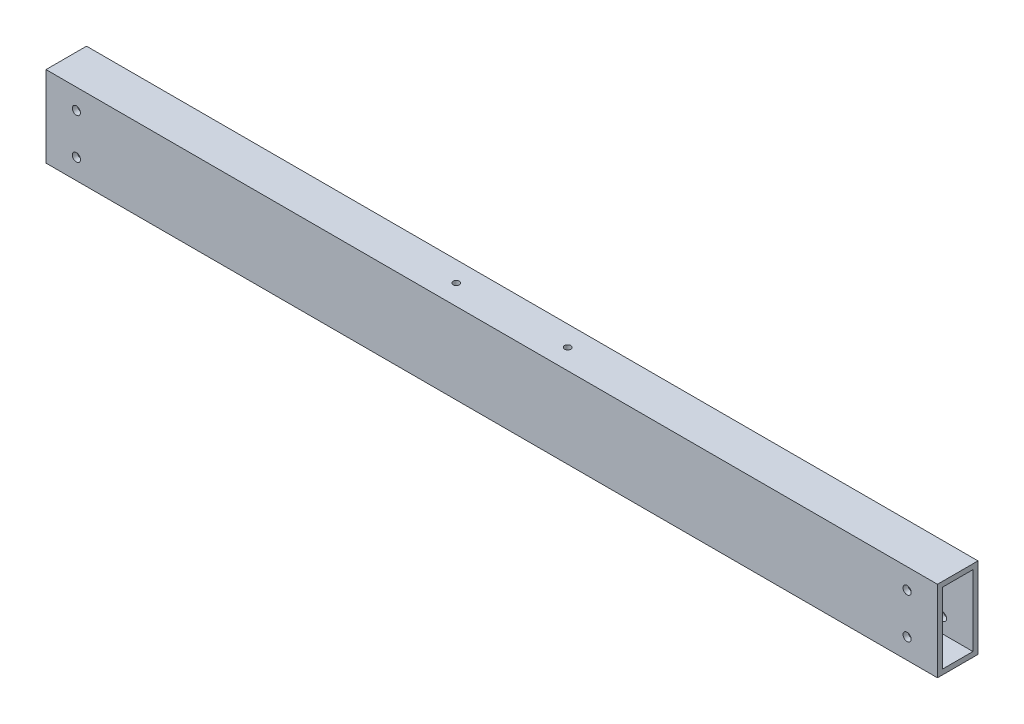
ISO-10303-21;
HEADER;
FILE_DESCRIPTION(('STEP AP214'),'2;1');
FILE_NAME('part.step','',(''),(''),'','','');
FILE_SCHEMA(('AUTOMOTIVE_DESIGN { 1 0 10303 214 1 1 1 1 }'));
ENDSEC;
DATA;
#1=APPLICATION_CONTEXT('core data for automotive mechanical design processes');
#2=APPLICATION_PROTOCOL_DEFINITION('international standard','automotive_design',2000,#1);
#3=PRODUCT_CONTEXT('',#1,'mechanical');
#4=PRODUCT('Part','Part','',(#3));
#5=PRODUCT_RELATED_PRODUCT_CATEGORY('part','',(#4));
#6=PRODUCT_DEFINITION_FORMATION('','',#4);
#7=PRODUCT_DEFINITION_CONTEXT('part definition',#1,'design');
#8=PRODUCT_DEFINITION('design','',#6,#7);
#9=PRODUCT_DEFINITION_SHAPE('','',#8);
#10=(LENGTH_UNIT() NAMED_UNIT(*) SI_UNIT(.MILLI.,.METRE.));
#11=(NAMED_UNIT(*) PLANE_ANGLE_UNIT() SI_UNIT($,.RADIAN.));
#12=(NAMED_UNIT(*) SI_UNIT($,.STERADIAN.) SOLID_ANGLE_UNIT());
#13=UNCERTAINTY_MEASURE_WITH_UNIT(LENGTH_MEASURE(1.E-05),#10,'distance_accuracy_value','');
#14=(GEOMETRIC_REPRESENTATION_CONTEXT(3) GLOBAL_UNCERTAINTY_ASSIGNED_CONTEXT((#13)) GLOBAL_UNIT_ASSIGNED_CONTEXT((#10,
#11,#12)) REPRESENTATION_CONTEXT('',''));
#15=CARTESIAN_POINT('',(0.,0.,0.));
#16=DIRECTION('',(0.,0.,1.));
#17=DIRECTION('',(1.,0.,0.));
#18=AXIS2_PLACEMENT_3D('',#15,#16,#17);
#19=CARTESIAN_POINT('',(279.4,25.4,12.7));
#20=DIRECTION('',(-1.,0.,0.));
#21=DIRECTION('',(0.,0.,1.));
#22=AXIS2_PLACEMENT_3D('',#19,#20,#21);
#23=PLANE('',#22);
#24=DIRECTION('',(0.,1.,0.));
#25=VECTOR('',#24,1.);
#26=CARTESIAN_POINT('',(279.4,-22.225,-9.525));
#27=LINE('',#26,#25);
#28=CARTESIAN_POINT('',(279.4,-22.225,-9.525));
#29=VERTEX_POINT('',#28);
#30=CARTESIAN_POINT('',(279.4,22.225,-9.525));
#31=VERTEX_POINT('',#30);
#32=EDGE_CURVE('E131',#29,#31,#27,.T.);
#33=ORIENTED_EDGE('',*,*,#32,.F.);
#34=DIRECTION('',(0.,0.,-1.));
#35=VECTOR('',#34,1.);
#36=CARTESIAN_POINT('',(279.4,-22.225,9.525));
#37=LINE('',#36,#35);
#38=CARTESIAN_POINT('',(279.4,-22.225,9.525));
#39=VERTEX_POINT('',#38);
#40=EDGE_CURVE('E51',#39,#29,#37,.T.);
#41=ORIENTED_EDGE('',*,*,#40,.F.);
#42=DIRECTION('',(0.,-1.,0.));
#43=VECTOR('',#42,1.);
#44=CARTESIAN_POINT('',(279.4,22.225,9.525));
#45=LINE('',#44,#43);
#46=CARTESIAN_POINT('',(279.4,22.225,9.525));
#47=VERTEX_POINT('',#46);
#48=EDGE_CURVE('E119',#47,#39,#45,.T.);
#49=ORIENTED_EDGE('',*,*,#48,.F.);
#50=DIRECTION('',(0.,0.,1.));
#51=VECTOR('',#50,1.);
#52=CARTESIAN_POINT('',(279.4,22.225,-9.525));
#53=LINE('',#52,#51);
#54=EDGE_CURVE('E122',#31,#47,#53,.T.);
#55=ORIENTED_EDGE('',*,*,#54,.F.);
#56=EDGE_LOOP('',(#33,#41,#49,#55));
#57=FACE_BOUND('',#56,.T.);
#58=DIRECTION('',(0.,1.,0.));
#59=VECTOR('',#58,1.);
#60=CARTESIAN_POINT('',(279.4,25.4,-12.7));
#61=LINE('',#60,#59);
#62=CARTESIAN_POINT('',(279.4,-25.4,-12.7));
#63=VERTEX_POINT('',#62);
#64=CARTESIAN_POINT('',(279.4,25.4,-12.7));
#65=VERTEX_POINT('',#64);
#66=EDGE_CURVE('E137',#63,#65,#61,.T.);
#67=ORIENTED_EDGE('',*,*,#66,.T.);
#68=DIRECTION('',(0.,0.,-1.));
#69=VECTOR('',#68,1.);
#70=CARTESIAN_POINT('',(279.4,25.4,12.7));
#71=LINE('',#70,#69);
#72=CARTESIAN_POINT('',(279.4,25.4,12.7));
#73=VERTEX_POINT('',#72);
#74=EDGE_CURVE('E11',#73,#65,#71,.T.);
#75=ORIENTED_EDGE('',*,*,#74,.F.);
#76=DIRECTION('',(0.,1.,0.));
#77=VECTOR('',#76,1.);
#78=CARTESIAN_POINT('',(279.4,25.4,12.7));
#79=LINE('',#78,#77);
#80=CARTESIAN_POINT('',(279.4,-25.4,12.7));
#81=VERTEX_POINT('',#80);
#82=EDGE_CURVE('E141',#81,#73,#79,.T.);
#83=ORIENTED_EDGE('',*,*,#82,.F.);
#84=DIRECTION('',(0.,0.,-1.));
#85=VECTOR('',#84,1.);
#86=CARTESIAN_POINT('',(279.4,-25.4,12.7));
#87=LINE('',#86,#85);
#88=EDGE_CURVE('E151',#81,#63,#87,.T.);
#89=ORIENTED_EDGE('',*,*,#88,.T.);
#90=EDGE_LOOP('',(#67,#75,#83,#89));
#91=FACE_BOUND('',#90,.T.);
#92=ADVANCED_FACE('F35',(#57,#91),#23,.F.);
#93=CARTESIAN_POINT('',(-279.4,25.4,12.7));
#94=DIRECTION('',(0.,-1.,0.));
#95=DIRECTION('',(0.,0.,-1.));
#96=AXIS2_PLACEMENT_3D('',#93,#94,#95);
#97=PLANE('',#96);
#98=CARTESIAN_POINT('',(-34.925,25.4,0.));
#99=DIRECTION('',(0.,1.,0.));
#100=DIRECTION('',(0.,0.,1.));
#101=AXIS2_PLACEMENT_3D('',#98,#99,#100);
#102=CIRCLE('',#101,1.98437499999999);
#103=CARTESIAN_POINT('',(-34.925,25.4,1.98437499999999));
#104=VERTEX_POINT('',#103);
#105=EDGE_CURVE('E374',#104,#104,#102,.T.);
#106=ORIENTED_EDGE('',*,*,#105,.F.);
#107=EDGE_LOOP('',(#106));
#108=FACE_BOUND('',#107,.T.);
#109=CARTESIAN_POINT('',(34.925,25.4,0.));
#110=DIRECTION('',(0.,1.,0.));
#111=DIRECTION('',(0.,0.,1.));
#112=AXIS2_PLACEMENT_3D('',#109,#110,#111);
#113=CIRCLE('',#112,1.98437499999999);
#114=CARTESIAN_POINT('',(34.925,25.4,1.98437499999999));
#115=VERTEX_POINT('',#114);
#116=EDGE_CURVE('E218',#115,#115,#113,.T.);
#117=ORIENTED_EDGE('',*,*,#116,.F.);
#118=EDGE_LOOP('',(#117));
#119=FACE_BOUND('',#118,.T.);
#120=DIRECTION('',(-1.,0.,0.));
#121=VECTOR('',#120,1.);
#122=CARTESIAN_POINT('',(-279.4,25.4,-12.7));
#123=LINE('',#122,#121);
#124=CARTESIAN_POINT('',(-279.4,25.4,-12.7));
#125=VERTEX_POINT('',#124);
#126=EDGE_CURVE('E154',#65,#125,#123,.T.);
#127=ORIENTED_EDGE('',*,*,#126,.T.);
#128=DIRECTION('',(0.,0.,-1.));
#129=VECTOR('',#128,1.);
#130=CARTESIAN_POINT('',(-279.4,25.4,12.7));
#131=LINE('',#130,#129);
#132=CARTESIAN_POINT('',(-279.4,25.4,12.7));
#133=VERTEX_POINT('',#132);
#134=EDGE_CURVE('E43',#133,#125,#131,.T.);
#135=ORIENTED_EDGE('',*,*,#134,.F.);
#136=DIRECTION('',(-1.,0.,0.));
#137=VECTOR('',#136,1.);
#138=CARTESIAN_POINT('',(-279.4,25.4,12.7));
#139=LINE('',#138,#137);
#140=EDGE_CURVE('E144',#73,#133,#139,.T.);
#141=ORIENTED_EDGE('',*,*,#140,.F.);
#142=ORIENTED_EDGE('',*,*,#74,.T.);
#143=EDGE_LOOP('',(#127,#135,#141,#142));
#144=FACE_BOUND('',#143,.T.);
#145=ADVANCED_FACE('F277',(#108,#119,#144),#97,.F.);
#146=CARTESIAN_POINT('',(-279.4,25.4,12.7));
#147=DIRECTION('',(1.,0.,0.));
#148=DIRECTION('',(0.,0.,-1.));
#149=AXIS2_PLACEMENT_3D('',#146,#147,#148);
#150=PLANE('',#149);
#151=DIRECTION('',(0.,-1.,0.));
#152=VECTOR('',#151,1.);
#153=CARTESIAN_POINT('',(-279.4,22.225,9.525));
#154=LINE('',#153,#152);
#155=CARTESIAN_POINT('',(-279.4,22.225,9.525));
#156=VERTEX_POINT('',#155);
#157=CARTESIAN_POINT('',(-279.4,-22.225,9.525));
#158=VERTEX_POINT('',#157);
#159=EDGE_CURVE('E109',#156,#158,#154,.T.);
#160=ORIENTED_EDGE('',*,*,#159,.T.);
#161=DIRECTION('',(0.,0.,-1.));
#162=VECTOR('',#161,1.);
#163=CARTESIAN_POINT('',(-279.4,-22.225,9.525));
#164=LINE('',#163,#162);
#165=CARTESIAN_POINT('',(-279.4,-22.225,-9.525));
#166=VERTEX_POINT('',#165);
#167=EDGE_CURVE('E103',#158,#166,#164,.T.);
#168=ORIENTED_EDGE('',*,*,#167,.T.);
#169=DIRECTION('',(0.,1.,0.));
#170=VECTOR('',#169,1.);
#171=CARTESIAN_POINT('',(-279.4,-22.225,-9.525));
#172=LINE('',#171,#170);
#173=CARTESIAN_POINT('',(-279.4,22.225,-9.525));
#174=VERTEX_POINT('',#173);
#175=EDGE_CURVE('E112',#166,#174,#172,.T.);
#176=ORIENTED_EDGE('',*,*,#175,.T.);
#177=DIRECTION('',(0.,0.,1.));
#178=VECTOR('',#177,1.);
#179=CARTESIAN_POINT('',(-279.4,22.225,-9.525));
#180=LINE('',#179,#178);
#181=EDGE_CURVE('E59',#174,#156,#180,.T.);
#182=ORIENTED_EDGE('',*,*,#181,.T.);
#183=EDGE_LOOP('',(#160,#168,#176,#182));
#184=FACE_BOUND('',#183,.T.);
#185=DIRECTION('',(0.,-1.,0.));
#186=VECTOR('',#185,1.);
#187=CARTESIAN_POINT('',(-279.4,25.4,-12.7));
#188=LINE('',#187,#186);
#189=CARTESIAN_POINT('',(-279.4,-25.4,-12.7));
#190=VERTEX_POINT('',#189);
#191=EDGE_CURVE('E156',#125,#190,#188,.T.);
#192=ORIENTED_EDGE('',*,*,#191,.T.);
#193=DIRECTION('',(0.,0.,-1.));
#194=VECTOR('',#193,1.);
#195=CARTESIAN_POINT('',(-279.4,-25.4,12.7));
#196=LINE('',#195,#194);
#197=CARTESIAN_POINT('',(-279.4,-25.4,12.7));
#198=VERTEX_POINT('',#197);
#199=EDGE_CURVE('E161',#198,#190,#196,.T.);
#200=ORIENTED_EDGE('',*,*,#199,.F.);
#201=DIRECTION('',(0.,-1.,0.));
#202=VECTOR('',#201,1.);
#203=CARTESIAN_POINT('',(-279.4,25.4,12.7));
#204=LINE('',#203,#202);
#205=EDGE_CURVE('E147',#133,#198,#204,.T.);
#206=ORIENTED_EDGE('',*,*,#205,.F.);
#207=ORIENTED_EDGE('',*,*,#134,.T.);
#208=EDGE_LOOP('',(#192,#200,#206,#207));
#209=FACE_BOUND('',#208,.T.);
#210=ADVANCED_FACE('F116',(#184,#209),#150,.F.);
#211=CARTESIAN_POINT('',(-279.4,-25.4,12.7));
#212=DIRECTION('',(0.,1.,0.));
#213=DIRECTION('',(0.,0.,1.));
#214=AXIS2_PLACEMENT_3D('',#211,#212,#213);
#215=PLANE('',#214);
#216=DIRECTION('',(1.,0.,0.));
#217=VECTOR('',#216,1.);
#218=CARTESIAN_POINT('',(-279.4,-25.4,-12.7));
#219=LINE('',#218,#217);
#220=EDGE_CURVE('E145',#190,#63,#219,.T.);
#221=ORIENTED_EDGE('',*,*,#220,.T.);
#222=ORIENTED_EDGE('',*,*,#88,.F.);
#223=DIRECTION('',(1.,0.,0.));
#224=VECTOR('',#223,1.);
#225=CARTESIAN_POINT('',(-279.4,-25.4,12.7));
#226=LINE('',#225,#224);
#227=EDGE_CURVE('E149',#198,#81,#226,.T.);
#228=ORIENTED_EDGE('',*,*,#227,.F.);
#229=ORIENTED_EDGE('',*,*,#199,.T.);
#230=EDGE_LOOP('',(#221,#222,#228,#229));
#231=FACE_BOUND('',#230,.T.);
#232=ADVANCED_FACE('F299',(#231),#215,.F.);
#233=CARTESIAN_POINT('',(0.,0.,12.7));
#234=DIRECTION('',(0.,0.,1.));
#235=DIRECTION('',(1.,0.,0.));
#236=AXIS2_PLACEMENT_3D('',#233,#234,#235);
#237=PLANE('',#236);
#238=CARTESIAN_POINT('',(-260.35,12.7,12.7));
#239=DIRECTION('',(0.,0.,1.));
#240=DIRECTION('',(1.,0.,0.));
#241=AXIS2_PLACEMENT_3D('',#238,#239,#240);
#242=CIRCLE('',#241,2.55269999999996);
#243=CARTESIAN_POINT('',(-257.7973,12.7,12.7));
#244=VERTEX_POINT('',#243);
#245=EDGE_CURVE('E188',#244,#244,#242,.T.);
#246=ORIENTED_EDGE('',*,*,#245,.F.);
#247=EDGE_LOOP('',(#246));
#248=FACE_BOUND('',#247,.T.);
#249=CARTESIAN_POINT('',(-260.35,-12.7,12.7));
#250=DIRECTION('',(0.,0.,1.));
#251=DIRECTION('',(1.,0.,0.));
#252=AXIS2_PLACEMENT_3D('',#249,#250,#251);
#253=CIRCLE('',#252,2.55269999999996);
#254=CARTESIAN_POINT('',(-257.7973,-12.7,12.7));
#255=VERTEX_POINT('',#254);
#256=EDGE_CURVE('E236',#255,#255,#253,.T.);
#257=ORIENTED_EDGE('',*,*,#256,.F.);
#258=EDGE_LOOP('',(#257));
#259=FACE_BOUND('',#258,.T.);
#260=CARTESIAN_POINT('',(260.35,12.7,12.7));
#261=DIRECTION('',(0.,0.,1.));
#262=DIRECTION('',(1.,0.,0.));
#263=AXIS2_PLACEMENT_3D('',#260,#261,#262);
#264=CIRCLE('',#263,2.55269999999996);
#265=CARTESIAN_POINT('',(262.9027,12.7,12.7));
#266=VERTEX_POINT('',#265);
#267=EDGE_CURVE('E243',#266,#266,#264,.T.);
#268=ORIENTED_EDGE('',*,*,#267,.F.);
#269=EDGE_LOOP('',(#268));
#270=FACE_BOUND('',#269,.T.);
#271=CARTESIAN_POINT('',(260.35,-12.7,12.7));
#272=DIRECTION('',(0.,0.,1.));
#273=DIRECTION('',(1.,0.,0.));
#274=AXIS2_PLACEMENT_3D('',#271,#272,#273);
#275=CIRCLE('',#274,2.55269999999996);
#276=CARTESIAN_POINT('',(262.9027,-12.7,12.7));
#277=VERTEX_POINT('',#276);
#278=EDGE_CURVE('E250',#277,#277,#275,.T.);
#279=ORIENTED_EDGE('',*,*,#278,.F.);
#280=EDGE_LOOP('',(#279));
#281=FACE_BOUND('',#280,.T.);
#282=ORIENTED_EDGE('',*,*,#82,.T.);
#283=ORIENTED_EDGE('',*,*,#140,.T.);
#284=ORIENTED_EDGE('',*,*,#205,.T.);
#285=ORIENTED_EDGE('',*,*,#227,.T.);
#286=EDGE_LOOP('',(#282,#283,#284,#285));
#287=FACE_BOUND('',#286,.T.);
#288=ADVANCED_FACE('F295',(#248,#259,#270,#281,#287),#237,.T.);
#289=CARTESIAN_POINT('',(0.,0.,-12.7));
#290=DIRECTION('',(0.,0.,1.));
#291=DIRECTION('',(1.,0.,0.));
#292=AXIS2_PLACEMENT_3D('',#289,#290,#291);
#293=PLANE('',#292);
#294=CARTESIAN_POINT('',(190.5,-13.49375,-12.7));
#295=DIRECTION('',(0.,0.,-1.));
#296=DIRECTION('',(-1.,0.,0.));
#297=AXIS2_PLACEMENT_3D('',#294,#295,#296);
#298=CIRCLE('',#297,2.0193);
#299=CARTESIAN_POINT('',(188.4807,-13.49375,-12.7));
#300=VERTEX_POINT('',#299);
#301=EDGE_CURVE('E207',#300,#300,#298,.T.);
#302=ORIENTED_EDGE('',*,*,#301,.F.);
#303=EDGE_LOOP('',(#302));
#304=FACE_BOUND('',#303,.T.);
#305=CARTESIAN_POINT('',(114.3,-13.49375,-12.7));
#306=DIRECTION('',(0.,0.,-1.));
#307=DIRECTION('',(-1.,0.,0.));
#308=AXIS2_PLACEMENT_3D('',#305,#306,#307);
#309=CIRCLE('',#308,2.0193);
#310=CARTESIAN_POINT('',(112.2807,-13.49375,-12.7));
#311=VERTEX_POINT('',#310);
#312=EDGE_CURVE('E204',#311,#311,#309,.T.);
#313=ORIENTED_EDGE('',*,*,#312,.F.);
#314=EDGE_LOOP('',(#313));
#315=FACE_BOUND('',#314,.T.);
#316=CARTESIAN_POINT('',(38.1000000000001,-13.49375,-12.7));
#317=DIRECTION('',(0.,0.,-1.));
#318=DIRECTION('',(-1.,0.,0.));
#319=AXIS2_PLACEMENT_3D('',#316,#317,#318);
#320=CIRCLE('',#319,2.0193);
#321=CARTESIAN_POINT('',(36.0807,-13.49375,-12.7));
#322=VERTEX_POINT('',#321);
#323=EDGE_CURVE('E201',#322,#322,#320,.T.);
#324=ORIENTED_EDGE('',*,*,#323,.F.);
#325=EDGE_LOOP('',(#324));
#326=FACE_BOUND('',#325,.T.);
#327=CARTESIAN_POINT('',(-38.1,-13.49375,-12.7));
#328=DIRECTION('',(0.,0.,-1.));
#329=DIRECTION('',(-1.,0.,0.));
#330=AXIS2_PLACEMENT_3D('',#327,#328,#329);
#331=CIRCLE('',#330,2.0193);
#332=CARTESIAN_POINT('',(-40.1193,-13.49375,-12.7));
#333=VERTEX_POINT('',#332);
#334=EDGE_CURVE('E197',#333,#333,#331,.T.);
#335=ORIENTED_EDGE('',*,*,#334,.F.);
#336=EDGE_LOOP('',(#335));
#337=FACE_BOUND('',#336,.T.);
#338=CARTESIAN_POINT('',(-114.3,-13.49375,-12.7));
#339=DIRECTION('',(0.,0.,-1.));
#340=DIRECTION('',(-1.,0.,0.));
#341=AXIS2_PLACEMENT_3D('',#338,#339,#340);
#342=CIRCLE('',#341,2.0193);
#343=CARTESIAN_POINT('',(-116.3193,-13.49375,-12.7));
#344=VERTEX_POINT('',#343);
#345=EDGE_CURVE('E193',#344,#344,#342,.T.);
#346=ORIENTED_EDGE('',*,*,#345,.F.);
#347=EDGE_LOOP('',(#346));
#348=FACE_BOUND('',#347,.T.);
#349=CARTESIAN_POINT('',(-190.5,-13.49375,-12.7));
#350=DIRECTION('',(0.,0.,-1.));
#351=DIRECTION('',(-1.,0.,0.));
#352=AXIS2_PLACEMENT_3D('',#349,#350,#351);
#353=CIRCLE('',#352,2.0193);
#354=CARTESIAN_POINT('',(-192.5193,-13.49375,-12.7));
#355=VERTEX_POINT('',#354);
#356=EDGE_CURVE('E189',#355,#355,#353,.T.);
#357=ORIENTED_EDGE('',*,*,#356,.F.);
#358=EDGE_LOOP('',(#357));
#359=FACE_BOUND('',#358,.T.);
#360=CARTESIAN_POINT('',(-260.35,12.7,-12.7));
#361=DIRECTION('',(0.,0.,1.));
#362=DIRECTION('',(1.,0.,0.));
#363=AXIS2_PLACEMENT_3D('',#360,#361,#362);
#364=CIRCLE('',#363,2.55270000000002);
#365=CARTESIAN_POINT('',(-257.7973,12.7,-12.7));
#366=VERTEX_POINT('',#365);
#367=EDGE_CURVE('E184',#366,#366,#364,.T.);
#368=ORIENTED_EDGE('',*,*,#367,.T.);
#369=EDGE_LOOP('',(#368));
#370=FACE_BOUND('',#369,.T.);
#371=CARTESIAN_POINT('',(-260.35,-12.7,-12.7));
#372=DIRECTION('',(0.,0.,1.));
#373=DIRECTION('',(1.,0.,0.));
#374=AXIS2_PLACEMENT_3D('',#371,#372,#373);
#375=CIRCLE('',#374,2.55270000000002);
#376=CARTESIAN_POINT('',(-257.7973,-12.7,-12.7));
#377=VERTEX_POINT('',#376);
#378=EDGE_CURVE('E179',#377,#377,#375,.T.);
#379=ORIENTED_EDGE('',*,*,#378,.T.);
#380=EDGE_LOOP('',(#379));
#381=FACE_BOUND('',#380,.T.);
#382=CARTESIAN_POINT('',(260.35,12.7,-12.7));
#383=DIRECTION('',(0.,0.,1.));
#384=DIRECTION('',(1.,0.,0.));
#385=AXIS2_PLACEMENT_3D('',#382,#383,#384);
#386=CIRCLE('',#385,2.55270000000002);
#387=CARTESIAN_POINT('',(262.9027,12.7,-12.7));
#388=VERTEX_POINT('',#387);
#389=EDGE_CURVE('E174',#388,#388,#386,.T.);
#390=ORIENTED_EDGE('',*,*,#389,.T.);
#391=EDGE_LOOP('',(#390));
#392=FACE_BOUND('',#391,.T.);
#393=CARTESIAN_POINT('',(260.35,-12.7,-12.7));
#394=DIRECTION('',(0.,0.,1.));
#395=DIRECTION('',(1.,0.,0.));
#396=AXIS2_PLACEMENT_3D('',#393,#394,#395);
#397=CIRCLE('',#396,2.55270000000002);
#398=CARTESIAN_POINT('',(262.9027,-12.7,-12.7));
#399=VERTEX_POINT('',#398);
#400=EDGE_CURVE('E169',#399,#399,#397,.T.);
#401=ORIENTED_EDGE('',*,*,#400,.T.);
#402=EDGE_LOOP('',(#401));
#403=FACE_BOUND('',#402,.T.);
#404=ORIENTED_EDGE('',*,*,#66,.F.);
#405=ORIENTED_EDGE('',*,*,#220,.F.);
#406=ORIENTED_EDGE('',*,*,#191,.F.);
#407=ORIENTED_EDGE('',*,*,#126,.F.);
#408=EDGE_LOOP('',(#404,#405,#406,#407));
#409=FACE_BOUND('',#408,.T.);
#410=ADVANCED_FACE('F255',(#304,#315,#326,#337,#348,#359,#370,#381,#392,#403,#409),#293,.F.);
#411=CARTESIAN_POINT('',(-279.4,-22.225,9.525));
#412=DIRECTION('',(0.,-1.,0.));
#413=DIRECTION('',(0.,0.,-1.));
#414=AXIS2_PLACEMENT_3D('',#411,#412,#413);
#415=PLANE('',#414);
#416=ORIENTED_EDGE('',*,*,#40,.T.);
#417=DIRECTION('',(1.,0.,0.));
#418=VECTOR('',#417,1.);
#419=CARTESIAN_POINT('',(-279.4,-22.225,-9.525));
#420=LINE('',#419,#418);
#421=EDGE_CURVE('E99',#166,#29,#420,.T.);
#422=ORIENTED_EDGE('',*,*,#421,.F.);
#423=ORIENTED_EDGE('',*,*,#167,.F.);
#424=DIRECTION('',(1.,0.,0.));
#425=VECTOR('',#424,1.);
#426=CARTESIAN_POINT('',(-279.4,-22.225,9.525));
#427=LINE('',#426,#425);
#428=EDGE_CURVE('E135',#158,#39,#427,.T.);
#429=ORIENTED_EDGE('',*,*,#428,.T.);
#430=EDGE_LOOP('',(#416,#422,#423,#429));
#431=FACE_BOUND('',#430,.T.);
#432=ADVANCED_FACE('F101',(#431),#415,.F.);
#433=CARTESIAN_POINT('',(-279.4,22.225,9.525));
#434=DIRECTION('',(0.,0.,1.));
#435=DIRECTION('',(1.,0.,0.));
#436=AXIS2_PLACEMENT_3D('',#433,#434,#435);
#437=PLANE('',#436);
#438=CARTESIAN_POINT('',(-260.35,12.7,9.525));
#439=DIRECTION('',(0.,0.,1.));
#440=DIRECTION('',(1.,0.,0.));
#441=AXIS2_PLACEMENT_3D('',#438,#439,#440);
#442=CIRCLE('',#441,2.55269999999999);
#443=CARTESIAN_POINT('',(-257.7973,12.7,9.525));
#444=VERTEX_POINT('',#443);
#445=EDGE_CURVE('E183',#444,#444,#442,.T.);
#446=ORIENTED_EDGE('',*,*,#445,.T.);
#447=EDGE_LOOP('',(#446));
#448=FACE_BOUND('',#447,.T.);
#449=CARTESIAN_POINT('',(-260.35,-12.7,9.525));
#450=DIRECTION('',(0.,0.,1.));
#451=DIRECTION('',(1.,0.,0.));
#452=AXIS2_PLACEMENT_3D('',#449,#450,#451);
#453=CIRCLE('',#452,2.55269999999999);
#454=CARTESIAN_POINT('',(-257.7973,-12.7,9.525));
#455=VERTEX_POINT('',#454);
#456=EDGE_CURVE('E178',#455,#455,#453,.T.);
#457=ORIENTED_EDGE('',*,*,#456,.T.);
#458=EDGE_LOOP('',(#457));
#459=FACE_BOUND('',#458,.T.);
#460=CARTESIAN_POINT('',(260.35,12.7,9.525));
#461=DIRECTION('',(0.,0.,1.));
#462=DIRECTION('',(1.,0.,0.));
#463=AXIS2_PLACEMENT_3D('',#460,#461,#462);
#464=CIRCLE('',#463,2.55269999999999);
#465=CARTESIAN_POINT('',(262.9027,12.7,9.525));
#466=VERTEX_POINT('',#465);
#467=EDGE_CURVE('E173',#466,#466,#464,.T.);
#468=ORIENTED_EDGE('',*,*,#467,.T.);
#469=EDGE_LOOP('',(#468));
#470=FACE_BOUND('',#469,.T.);
#471=CARTESIAN_POINT('',(260.35,-12.7,9.525));
#472=DIRECTION('',(0.,0.,1.));
#473=DIRECTION('',(1.,0.,0.));
#474=AXIS2_PLACEMENT_3D('',#471,#472,#473);
#475=CIRCLE('',#474,2.55269999999999);
#476=CARTESIAN_POINT('',(262.9027,-12.7,9.525));
#477=VERTEX_POINT('',#476);
#478=EDGE_CURVE('E125',#477,#477,#475,.T.);
#479=ORIENTED_EDGE('',*,*,#478,.T.);
#480=EDGE_LOOP('',(#479));
#481=FACE_BOUND('',#480,.T.);
#482=ORIENTED_EDGE('',*,*,#48,.T.);
#483=ORIENTED_EDGE('',*,*,#428,.F.);
#484=ORIENTED_EDGE('',*,*,#159,.F.);
#485=DIRECTION('',(1.,0.,0.));
#486=VECTOR('',#485,1.);
#487=CARTESIAN_POINT('',(-279.4,22.225,9.525));
#488=LINE('',#487,#486);
#489=EDGE_CURVE('E138',#156,#47,#488,.T.);
#490=ORIENTED_EDGE('',*,*,#489,.T.);
#491=EDGE_LOOP('',(#482,#483,#484,#490));
#492=FACE_BOUND('',#491,.T.);
#493=ADVANCED_FACE('F271',(#448,#459,#470,#481,#492),#437,.F.);
#494=CARTESIAN_POINT('',(-279.4,22.225,-9.525));
#495=DIRECTION('',(0.,1.,0.));
#496=DIRECTION('',(0.,0.,1.));
#497=AXIS2_PLACEMENT_3D('',#494,#495,#496);
#498=PLANE('',#497);
#499=CARTESIAN_POINT('',(-34.925,22.225,0.));
#500=DIRECTION('',(0.,1.,0.));
#501=DIRECTION('',(0.,0.,1.));
#502=AXIS2_PLACEMENT_3D('',#499,#500,#501);
#503=CIRCLE('',#502,1.98437499999999);
#504=CARTESIAN_POINT('',(-34.925,22.225,1.98437499999999));
#505=VERTEX_POINT('',#504);
#506=EDGE_CURVE('E38',#505,#505,#503,.T.);
#507=ORIENTED_EDGE('',*,*,#506,.T.);
#508=EDGE_LOOP('',(#507));
#509=FACE_BOUND('',#508,.T.);
#510=CARTESIAN_POINT('',(34.925,22.225,0.));
#511=DIRECTION('',(0.,1.,0.));
#512=DIRECTION('',(0.,0.,1.));
#513=AXIS2_PLACEMENT_3D('',#510,#511,#512);
#514=CIRCLE('',#513,1.98437499999999);
#515=CARTESIAN_POINT('',(34.925,22.225,1.98437499999999));
#516=VERTEX_POINT('',#515);
#517=EDGE_CURVE('E213',#516,#516,#514,.T.);
#518=ORIENTED_EDGE('',*,*,#517,.T.);
#519=EDGE_LOOP('',(#518));
#520=FACE_BOUND('',#519,.T.);
#521=ORIENTED_EDGE('',*,*,#54,.T.);
#522=ORIENTED_EDGE('',*,*,#489,.F.);
#523=ORIENTED_EDGE('',*,*,#181,.F.);
#524=DIRECTION('',(1.,0.,0.));
#525=VECTOR('',#524,1.);
#526=CARTESIAN_POINT('',(-279.4,22.225,-9.525));
#527=LINE('',#526,#525);
#528=EDGE_CURVE('E108',#174,#31,#527,.T.);
#529=ORIENTED_EDGE('',*,*,#528,.T.);
#530=EDGE_LOOP('',(#521,#522,#523,#529));
#531=FACE_BOUND('',#530,.T.);
#532=ADVANCED_FACE('F266',(#509,#520,#531),#498,.F.);
#533=CARTESIAN_POINT('',(-279.4,-22.225,-9.525));
#534=DIRECTION('',(0.,0.,-1.));
#535=DIRECTION('',(-1.,0.,0.));
#536=AXIS2_PLACEMENT_3D('',#533,#534,#535);
#537=PLANE('',#536);
#538=CARTESIAN_POINT('',(190.5,-13.49375,-9.525));
#539=DIRECTION('',(0.,0.,-1.));
#540=DIRECTION('',(-1.,0.,0.));
#541=AXIS2_PLACEMENT_3D('',#538,#539,#540);
#542=CIRCLE('',#541,2.0193);
#543=CARTESIAN_POINT('',(188.4807,-13.49375,-9.525));
#544=VERTEX_POINT('',#543);
#545=EDGE_CURVE('E205',#544,#544,#542,.T.);
#546=ORIENTED_EDGE('',*,*,#545,.T.);
#547=EDGE_LOOP('',(#546));
#548=FACE_BOUND('',#547,.T.);
#549=CARTESIAN_POINT('',(114.3,-13.49375,-9.525));
#550=DIRECTION('',(0.,0.,-1.));
#551=DIRECTION('',(-1.,0.,0.));
#552=AXIS2_PLACEMENT_3D('',#549,#550,#551);
#553=CIRCLE('',#552,2.0193);
#554=CARTESIAN_POINT('',(112.2807,-13.49375,-9.525));
#555=VERTEX_POINT('',#554);
#556=EDGE_CURVE('E202',#555,#555,#553,.T.);
#557=ORIENTED_EDGE('',*,*,#556,.T.);
#558=EDGE_LOOP('',(#557));
#559=FACE_BOUND('',#558,.T.);
#560=CARTESIAN_POINT('',(38.1000000000001,-13.49375,-9.525));
#561=DIRECTION('',(0.,0.,-1.));
#562=DIRECTION('',(-1.,0.,0.));
#563=AXIS2_PLACEMENT_3D('',#560,#561,#562);
#564=CIRCLE('',#563,2.0193);
#565=CARTESIAN_POINT('',(36.0807,-13.49375,-9.525));
#566=VERTEX_POINT('',#565);
#567=EDGE_CURVE('E198',#566,#566,#564,.T.);
#568=ORIENTED_EDGE('',*,*,#567,.T.);
#569=EDGE_LOOP('',(#568));
#570=FACE_BOUND('',#569,.T.);
#571=CARTESIAN_POINT('',(-38.1,-13.49375,-9.525));
#572=DIRECTION('',(0.,0.,-1.));
#573=DIRECTION('',(-1.,0.,0.));
#574=AXIS2_PLACEMENT_3D('',#571,#572,#573);
#575=CIRCLE('',#574,2.0193);
#576=CARTESIAN_POINT('',(-40.1193,-13.49375,-9.525));
#577=VERTEX_POINT('',#576);
#578=EDGE_CURVE('E194',#577,#577,#575,.T.);
#579=ORIENTED_EDGE('',*,*,#578,.T.);
#580=EDGE_LOOP('',(#579));
#581=FACE_BOUND('',#580,.T.);
#582=CARTESIAN_POINT('',(-114.3,-13.49375,-9.525));
#583=DIRECTION('',(0.,0.,-1.));
#584=DIRECTION('',(-1.,0.,0.));
#585=AXIS2_PLACEMENT_3D('',#582,#583,#584);
#586=CIRCLE('',#585,2.0193);
#587=CARTESIAN_POINT('',(-116.3193,-13.49375,-9.525));
#588=VERTEX_POINT('',#587);
#589=EDGE_CURVE('E190',#588,#588,#586,.T.);
#590=ORIENTED_EDGE('',*,*,#589,.T.);
#591=EDGE_LOOP('',(#590));
#592=FACE_BOUND('',#591,.T.);
#593=CARTESIAN_POINT('',(-190.5,-13.49375,-9.525));
#594=DIRECTION('',(0.,0.,-1.));
#595=DIRECTION('',(-1.,0.,0.));
#596=AXIS2_PLACEMENT_3D('',#593,#594,#595);
#597=CIRCLE('',#596,2.0193);
#598=CARTESIAN_POINT('',(-192.5193,-13.49375,-9.525));
#599=VERTEX_POINT('',#598);
#600=EDGE_CURVE('E185',#599,#599,#597,.T.);
#601=ORIENTED_EDGE('',*,*,#600,.T.);
#602=EDGE_LOOP('',(#601));
#603=FACE_BOUND('',#602,.T.);
#604=CARTESIAN_POINT('',(-260.35,12.7,-9.525));
#605=DIRECTION('',(0.,0.,-1.));
#606=DIRECTION('',(-1.,0.,0.));
#607=AXIS2_PLACEMENT_3D('',#604,#605,#606);
#608=CIRCLE('',#607,2.55269999999999);
#609=CARTESIAN_POINT('',(-262.9027,12.7,-9.525));
#610=VERTEX_POINT('',#609);
#611=EDGE_CURVE('E180',#610,#610,#608,.T.);
#612=ORIENTED_EDGE('',*,*,#611,.T.);
#613=EDGE_LOOP('',(#612));
#614=FACE_BOUND('',#613,.T.);
#615=CARTESIAN_POINT('',(-260.35,-12.7,-9.525));
#616=DIRECTION('',(0.,0.,-1.));
#617=DIRECTION('',(-1.,0.,0.));
#618=AXIS2_PLACEMENT_3D('',#615,#616,#617);
#619=CIRCLE('',#618,2.55269999999999);
#620=CARTESIAN_POINT('',(-262.9027,-12.7,-9.525));
#621=VERTEX_POINT('',#620);
#622=EDGE_CURVE('E175',#621,#621,#619,.T.);
#623=ORIENTED_EDGE('',*,*,#622,.T.);
#624=EDGE_LOOP('',(#623));
#625=FACE_BOUND('',#624,.T.);
#626=CARTESIAN_POINT('',(260.35,12.7,-9.525));
#627=DIRECTION('',(0.,0.,-1.));
#628=DIRECTION('',(-1.,0.,0.));
#629=AXIS2_PLACEMENT_3D('',#626,#627,#628);
#630=CIRCLE('',#629,2.55269999999999);
#631=CARTESIAN_POINT('',(257.7973,12.7,-9.525));
#632=VERTEX_POINT('',#631);
#633=EDGE_CURVE('E170',#632,#632,#630,.T.);
#634=ORIENTED_EDGE('',*,*,#633,.T.);
#635=EDGE_LOOP('',(#634));
#636=FACE_BOUND('',#635,.T.);
#637=CARTESIAN_POINT('',(260.35,-12.7,-9.525));
#638=DIRECTION('',(0.,0.,-1.));
#639=DIRECTION('',(-1.,0.,0.));
#640=AXIS2_PLACEMENT_3D('',#637,#638,#639);
#641=CIRCLE('',#640,2.55269999999999);
#642=CARTESIAN_POINT('',(257.7973,-12.7,-9.525));
#643=VERTEX_POINT('',#642);
#644=EDGE_CURVE('E166',#643,#643,#641,.T.);
#645=ORIENTED_EDGE('',*,*,#644,.T.);
#646=EDGE_LOOP('',(#645));
#647=FACE_BOUND('',#646,.T.);
#648=ORIENTED_EDGE('',*,*,#32,.T.);
#649=ORIENTED_EDGE('',*,*,#528,.F.);
#650=ORIENTED_EDGE('',*,*,#175,.F.);
#651=ORIENTED_EDGE('',*,*,#421,.T.);
#652=EDGE_LOOP('',(#648,#649,#650,#651));
#653=FACE_BOUND('',#652,.T.);
#654=ADVANCED_FACE('F113',(#548,#559,#570,#581,#592,#603,#614,#625,#636,#647,#653),#537,.F.);
#655=CARTESIAN_POINT('',(260.35,-12.7,12.7));
#656=DIRECTION('',(0.,0.,1.));
#657=DIRECTION('',(1.,0.,0.));
#658=AXIS2_PLACEMENT_3D('',#655,#656,#657);
#659=CYLINDRICAL_SURFACE('',#658,2.55269999999999);
#660=ORIENTED_EDGE('',*,*,#400,.F.);
#661=EDGE_LOOP('',(#660));
#662=FACE_BOUND('',#661,.T.);
#663=ORIENTED_EDGE('',*,*,#644,.F.);
#664=EDGE_LOOP('',(#663));
#665=FACE_BOUND('',#664,.T.);
#666=ADVANCED_FACE('F258',(#662,#665),#659,.F.);
#667=ORIENTED_EDGE('',*,*,#278,.T.);
#668=EDGE_LOOP('',(#667));
#669=FACE_BOUND('',#668,.T.);
#670=ORIENTED_EDGE('',*,*,#478,.F.);
#671=EDGE_LOOP('',(#670));
#672=FACE_BOUND('',#671,.T.);
#673=ADVANCED_FACE('F261',(#669,#672),#659,.F.);
#674=CARTESIAN_POINT('',(260.35,12.7,12.7));
#675=DIRECTION('',(0.,0.,1.));
#676=DIRECTION('',(1.,0.,0.));
#677=AXIS2_PLACEMENT_3D('',#674,#675,#676);
#678=CYLINDRICAL_SURFACE('',#677,2.55269999999999);
#679=ORIENTED_EDGE('',*,*,#389,.F.);
#680=EDGE_LOOP('',(#679));
#681=FACE_BOUND('',#680,.T.);
#682=ORIENTED_EDGE('',*,*,#633,.F.);
#683=EDGE_LOOP('',(#682));
#684=FACE_BOUND('',#683,.T.);
#685=ADVANCED_FACE('F323',(#681,#684),#678,.F.);
#686=ORIENTED_EDGE('',*,*,#267,.T.);
#687=EDGE_LOOP('',(#686));
#688=FACE_BOUND('',#687,.T.);
#689=ORIENTED_EDGE('',*,*,#467,.F.);
#690=EDGE_LOOP('',(#689));
#691=FACE_BOUND('',#690,.T.);
#692=ADVANCED_FACE('F325',(#688,#691),#678,.F.);
#693=CARTESIAN_POINT('',(-260.35,-12.7,12.7));
#694=DIRECTION('',(0.,0.,1.));
#695=DIRECTION('',(1.,0.,0.));
#696=AXIS2_PLACEMENT_3D('',#693,#694,#695);
#697=CYLINDRICAL_SURFACE('',#696,2.55269999999999);
#698=ORIENTED_EDGE('',*,*,#378,.F.);
#699=EDGE_LOOP('',(#698));
#700=FACE_BOUND('',#699,.T.);
#701=ORIENTED_EDGE('',*,*,#622,.F.);
#702=EDGE_LOOP('',(#701));
#703=FACE_BOUND('',#702,.T.);
#704=ADVANCED_FACE('F328',(#700,#703),#697,.F.);
#705=ORIENTED_EDGE('',*,*,#256,.T.);
#706=EDGE_LOOP('',(#705));
#707=FACE_BOUND('',#706,.T.);
#708=ORIENTED_EDGE('',*,*,#456,.F.);
#709=EDGE_LOOP('',(#708));
#710=FACE_BOUND('',#709,.T.);
#711=ADVANCED_FACE('F330',(#707,#710),#697,.F.);
#712=CARTESIAN_POINT('',(-260.35,12.7,12.7));
#713=DIRECTION('',(0.,0.,1.));
#714=DIRECTION('',(1.,0.,0.));
#715=AXIS2_PLACEMENT_3D('',#712,#713,#714);
#716=CYLINDRICAL_SURFACE('',#715,2.55269999999999);
#717=ORIENTED_EDGE('',*,*,#367,.F.);
#718=EDGE_LOOP('',(#717));
#719=FACE_BOUND('',#718,.T.);
#720=ORIENTED_EDGE('',*,*,#611,.F.);
#721=EDGE_LOOP('',(#720));
#722=FACE_BOUND('',#721,.T.);
#723=ADVANCED_FACE('F333',(#719,#722),#716,.F.);
#724=ORIENTED_EDGE('',*,*,#245,.T.);
#725=EDGE_LOOP('',(#724));
#726=FACE_BOUND('',#725,.T.);
#727=ORIENTED_EDGE('',*,*,#445,.F.);
#728=EDGE_LOOP('',(#727));
#729=FACE_BOUND('',#728,.T.);
#730=ADVANCED_FACE('F335',(#726,#729),#716,.F.);
#731=CARTESIAN_POINT('',(-190.5,-13.49375,-12.7));
#732=DIRECTION('',(0.,0.,-1.));
#733=DIRECTION('',(-1.,0.,0.));
#734=AXIS2_PLACEMENT_3D('',#731,#732,#733);
#735=CYLINDRICAL_SURFACE('',#734,2.0193);
#736=ORIENTED_EDGE('',*,*,#356,.T.);
#737=EDGE_LOOP('',(#736));
#738=FACE_BOUND('',#737,.T.);
#739=ORIENTED_EDGE('',*,*,#600,.F.);
#740=EDGE_LOOP('',(#739));
#741=FACE_BOUND('',#740,.T.);
#742=ADVANCED_FACE('F338',(#738,#741),#735,.F.);
#743=CARTESIAN_POINT('',(-114.3,-13.49375,-12.7));
#744=DIRECTION('',(0.,0.,-1.));
#745=DIRECTION('',(-1.,0.,0.));
#746=AXIS2_PLACEMENT_3D('',#743,#744,#745);
#747=CYLINDRICAL_SURFACE('',#746,2.0193);
#748=ORIENTED_EDGE('',*,*,#345,.T.);
#749=EDGE_LOOP('',(#748));
#750=FACE_BOUND('',#749,.T.);
#751=ORIENTED_EDGE('',*,*,#589,.F.);
#752=EDGE_LOOP('',(#751));
#753=FACE_BOUND('',#752,.T.);
#754=ADVANCED_FACE('F342',(#750,#753),#747,.F.);
#755=CARTESIAN_POINT('',(-38.1,-13.49375,-12.7));
#756=DIRECTION('',(0.,0.,-1.));
#757=DIRECTION('',(-1.,0.,0.));
#758=AXIS2_PLACEMENT_3D('',#755,#756,#757);
#759=CYLINDRICAL_SURFACE('',#758,2.0193);
#760=ORIENTED_EDGE('',*,*,#334,.T.);
#761=EDGE_LOOP('',(#760));
#762=FACE_BOUND('',#761,.T.);
#763=ORIENTED_EDGE('',*,*,#578,.F.);
#764=EDGE_LOOP('',(#763));
#765=FACE_BOUND('',#764,.T.);
#766=ADVANCED_FACE('F346',(#762,#765),#759,.F.);
#767=CARTESIAN_POINT('',(38.1000000000001,-13.49375,-12.7));
#768=DIRECTION('',(0.,0.,-1.));
#769=DIRECTION('',(-1.,0.,0.));
#770=AXIS2_PLACEMENT_3D('',#767,#768,#769);
#771=CYLINDRICAL_SURFACE('',#770,2.0193);
#772=ORIENTED_EDGE('',*,*,#323,.T.);
#773=EDGE_LOOP('',(#772));
#774=FACE_BOUND('',#773,.T.);
#775=ORIENTED_EDGE('',*,*,#567,.F.);
#776=EDGE_LOOP('',(#775));
#777=FACE_BOUND('',#776,.T.);
#778=ADVANCED_FACE('F350',(#774,#777),#771,.F.);
#779=CARTESIAN_POINT('',(114.3,-13.49375,-12.7));
#780=DIRECTION('',(0.,0.,-1.));
#781=DIRECTION('',(-1.,0.,0.));
#782=AXIS2_PLACEMENT_3D('',#779,#780,#781);
#783=CYLINDRICAL_SURFACE('',#782,2.0193);
#784=ORIENTED_EDGE('',*,*,#312,.T.);
#785=EDGE_LOOP('',(#784));
#786=FACE_BOUND('',#785,.T.);
#787=ORIENTED_EDGE('',*,*,#556,.F.);
#788=EDGE_LOOP('',(#787));
#789=FACE_BOUND('',#788,.T.);
#790=ADVANCED_FACE('F354',(#786,#789),#783,.F.);
#791=CARTESIAN_POINT('',(190.5,-13.49375,-12.7));
#792=DIRECTION('',(0.,0.,-1.));
#793=DIRECTION('',(-1.,0.,0.));
#794=AXIS2_PLACEMENT_3D('',#791,#792,#793);
#795=CYLINDRICAL_SURFACE('',#794,2.0193);
#796=ORIENTED_EDGE('',*,*,#301,.T.);
#797=EDGE_LOOP('',(#796));
#798=FACE_BOUND('',#797,.T.);
#799=ORIENTED_EDGE('',*,*,#545,.F.);
#800=EDGE_LOOP('',(#799));
#801=FACE_BOUND('',#800,.T.);
#802=ADVANCED_FACE('F358',(#798,#801),#795,.F.);
#803=CARTESIAN_POINT('',(34.925,25.4,0.));
#804=DIRECTION('',(0.,1.,0.));
#805=DIRECTION('',(0.,0.,1.));
#806=AXIS2_PLACEMENT_3D('',#803,#804,#805);
#807=CYLINDRICAL_SURFACE('',#806,1.98437499999999);
#808=ORIENTED_EDGE('',*,*,#116,.T.);
#809=EDGE_LOOP('',(#808));
#810=FACE_BOUND('',#809,.T.);
#811=ORIENTED_EDGE('',*,*,#517,.F.);
#812=EDGE_LOOP('',(#811));
#813=FACE_BOUND('',#812,.T.);
#814=ADVANCED_FACE('F362',(#810,#813),#807,.F.);
#815=CARTESIAN_POINT('',(-34.925,25.4,0.));
#816=DIRECTION('',(0.,1.,0.));
#817=DIRECTION('',(0.,0.,1.));
#818=AXIS2_PLACEMENT_3D('',#815,#816,#817);
#819=CYLINDRICAL_SURFACE('',#818,1.98437499999999);
#820=ORIENTED_EDGE('',*,*,#105,.T.);
#821=EDGE_LOOP('',(#820));
#822=FACE_BOUND('',#821,.T.);
#823=ORIENTED_EDGE('',*,*,#506,.F.);
#824=EDGE_LOOP('',(#823));
#825=FACE_BOUND('',#824,.T.);
#826=ADVANCED_FACE('F365',(#822,#825),#819,.F.);
#827=CLOSED_SHELL('',(#92,#145,#210,#232,#288,#410,#432,#493,#532,#654,#666,#673,#685,#692,#704,
#711,#723,#730,#742,#754,#766,#778,#790,#802,#814,#826));
#828=MANIFOLD_SOLID_BREP('B2',#827);
#829=ADVANCED_BREP_SHAPE_REPRESENTATION('',(#18,#828),#14);
#830=SHAPE_DEFINITION_REPRESENTATION(#9,#829);
ENDSEC;
END-ISO-10303-21;
